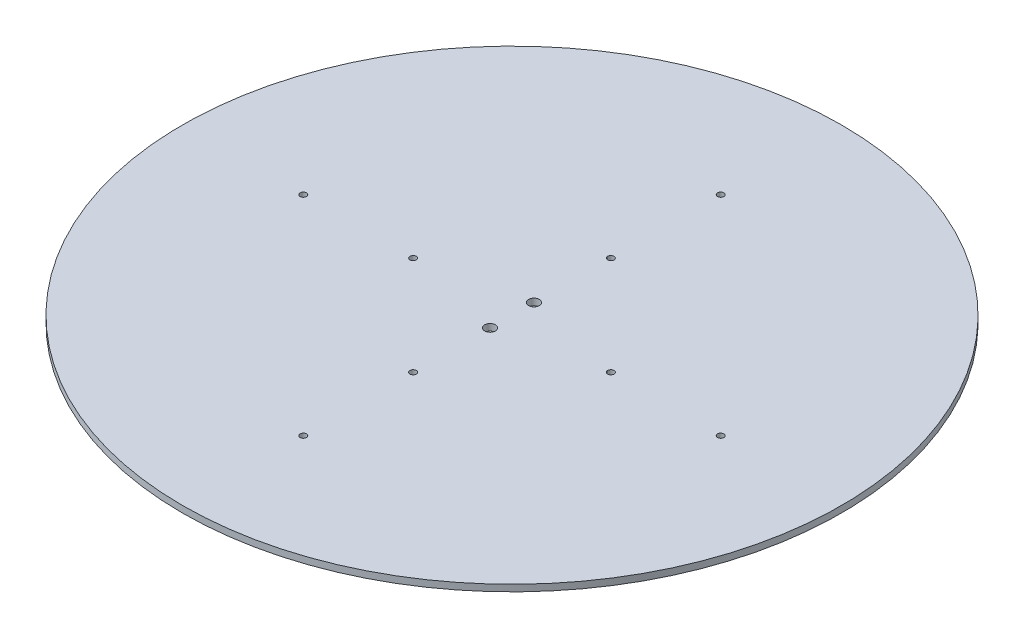
ISO-10303-21;
HEADER;
FILE_DESCRIPTION(('STEP AP214'),'2;1');
FILE_NAME('part.step','',(''),(''),'','','');
FILE_SCHEMA(('AUTOMOTIVE_DESIGN { 1 0 10303 214 1 1 1 1 }'));
ENDSEC;
DATA;
#1=APPLICATION_CONTEXT('core data for automotive mechanical design processes');
#2=APPLICATION_PROTOCOL_DEFINITION('international standard','automotive_design',2000,#1);
#3=PRODUCT_CONTEXT('',#1,'mechanical');
#4=PRODUCT('Part','Part','',(#3));
#5=PRODUCT_RELATED_PRODUCT_CATEGORY('part','',(#4));
#6=PRODUCT_DEFINITION_FORMATION('','',#4);
#7=PRODUCT_DEFINITION_CONTEXT('part definition',#1,'design');
#8=PRODUCT_DEFINITION('design','',#6,#7);
#9=PRODUCT_DEFINITION_SHAPE('','',#8);
#10=(LENGTH_UNIT() NAMED_UNIT(*) SI_UNIT(.MILLI.,.METRE.));
#11=(NAMED_UNIT(*) PLANE_ANGLE_UNIT() SI_UNIT($,.RADIAN.));
#12=(NAMED_UNIT(*) SI_UNIT($,.STERADIAN.) SOLID_ANGLE_UNIT());
#13=UNCERTAINTY_MEASURE_WITH_UNIT(LENGTH_MEASURE(1.E-05),#10,'distance_accuracy_value','');
#14=(GEOMETRIC_REPRESENTATION_CONTEXT(3) GLOBAL_UNCERTAINTY_ASSIGNED_CONTEXT((#13)) GLOBAL_UNIT_ASSIGNED_CONTEXT((#10,
#11,#12)) REPRESENTATION_CONTEXT('',''));
#15=CARTESIAN_POINT('',(0.,0.,0.));
#16=DIRECTION('',(0.,0.,1.));
#17=DIRECTION('',(1.,0.,0.));
#18=AXIS2_PLACEMENT_3D('',#15,#16,#17);
#19=CARTESIAN_POINT('',(-45.,3.,0.));
#20=DIRECTION('',(0.,-1.,0.));
#21=DIRECTION('',(0.,0.,-1.));
#22=AXIS2_PLACEMENT_3D('',#19,#20,#21);
#23=CYLINDRICAL_SURFACE('',#22,1.45);
#24=CARTESIAN_POINT('',(-45.,3.,0.));
#25=DIRECTION('',(0.,1.,0.));
#26=DIRECTION('',(0.,0.,1.));
#27=AXIS2_PLACEMENT_3D('',#24,#25,#26);
#28=CIRCLE('',#27,1.45);
#29=CARTESIAN_POINT('',(-45.,3.,1.45));
#30=VERTEX_POINT('',#29);
#31=EDGE_CURVE('E38',#30,#30,#28,.F.);
#32=ORIENTED_EDGE('',*,*,#31,.F.);
#33=EDGE_LOOP('',(#32));
#34=FACE_BOUND('',#33,.T.);
#35=CARTESIAN_POINT('',(-45.,0.,0.));
#36=DIRECTION('',(0.,1.,0.));
#37=DIRECTION('',(0.,0.,1.));
#38=AXIS2_PLACEMENT_3D('',#35,#36,#37);
#39=CIRCLE('',#38,1.45);
#40=CARTESIAN_POINT('',(-45.,0.,1.45));
#41=VERTEX_POINT('',#40);
#42=EDGE_CURVE('E73',#41,#41,#39,.F.);
#43=ORIENTED_EDGE('',*,*,#42,.T.);
#44=EDGE_LOOP('',(#43));
#45=FACE_BOUND('',#44,.T.);
#46=ADVANCED_FACE('F30',(#34,#45),#23,.F.);
#47=CARTESIAN_POINT('',(0.,3.,0.));
#48=DIRECTION('',(0.,-1.,0.));
#49=DIRECTION('',(0.,0.,-1.));
#50=AXIS2_PLACEMENT_3D('',#47,#48,#49);
#51=CYLINDRICAL_SURFACE('',#50,150.);
#52=CARTESIAN_POINT('',(0.,3.,0.));
#53=DIRECTION('',(0.,1.,0.));
#54=DIRECTION('',(0.,0.,1.));
#55=AXIS2_PLACEMENT_3D('',#52,#53,#54);
#56=CIRCLE('',#55,150.);
#57=CARTESIAN_POINT('',(0.,3.,150.));
#58=VERTEX_POINT('',#57);
#59=EDGE_CURVE('E43',#58,#58,#56,.T.);
#60=ORIENTED_EDGE('',*,*,#59,.F.);
#61=EDGE_LOOP('',(#60));
#62=FACE_BOUND('',#61,.T.);
#63=CARTESIAN_POINT('',(0.,0.,0.));
#64=DIRECTION('',(0.,1.,0.));
#65=DIRECTION('',(0.,0.,1.));
#66=AXIS2_PLACEMENT_3D('',#63,#64,#65);
#67=CIRCLE('',#66,150.);
#68=CARTESIAN_POINT('',(0.,0.,150.));
#69=VERTEX_POINT('',#68);
#70=EDGE_CURVE('E71',#69,#69,#67,.T.);
#71=ORIENTED_EDGE('',*,*,#70,.T.);
#72=EDGE_LOOP('',(#71));
#73=FACE_BOUND('',#72,.T.);
#74=ADVANCED_FACE('F112',(#62,#73),#51,.T.);
#75=CARTESIAN_POINT('',(0.,3.,-10.));
#76=DIRECTION('',(0.,-1.,0.));
#77=DIRECTION('',(0.,0.,-1.));
#78=AXIS2_PLACEMENT_3D('',#75,#76,#77);
#79=CYLINDRICAL_SURFACE('',#78,2.45);
#80=CARTESIAN_POINT('',(0.,3.,-10.));
#81=DIRECTION('',(0.,1.,0.));
#82=DIRECTION('',(0.,0.,1.));
#83=AXIS2_PLACEMENT_3D('',#80,#81,#82);
#84=CIRCLE('',#83,2.45);
#85=CARTESIAN_POINT('',(0.,3.,-7.55));
#86=VERTEX_POINT('',#85);
#87=EDGE_CURVE('E104',#86,#86,#84,.T.);
#88=ORIENTED_EDGE('',*,*,#87,.T.);
#89=EDGE_LOOP('',(#88));
#90=FACE_BOUND('',#89,.T.);
#91=CARTESIAN_POINT('',(0.,0.,-10.));
#92=DIRECTION('',(0.,1.,0.));
#93=DIRECTION('',(0.,0.,1.));
#94=AXIS2_PLACEMENT_3D('',#91,#92,#93);
#95=CIRCLE('',#94,2.45);
#96=CARTESIAN_POINT('',(0.,0.,-7.55));
#97=VERTEX_POINT('',#96);
#98=EDGE_CURVE('E68',#97,#97,#95,.T.);
#99=ORIENTED_EDGE('',*,*,#98,.F.);
#100=EDGE_LOOP('',(#99));
#101=FACE_BOUND('',#100,.T.);
#102=ADVANCED_FACE('F115',(#90,#101),#79,.F.);
#103=CARTESIAN_POINT('',(0.,3.,10.));
#104=DIRECTION('',(0.,-1.,0.));
#105=DIRECTION('',(0.,0.,-1.));
#106=AXIS2_PLACEMENT_3D('',#103,#104,#105);
#107=CYLINDRICAL_SURFACE('',#106,2.45);
#108=CARTESIAN_POINT('',(0.,3.,10.));
#109=DIRECTION('',(0.,1.,0.));
#110=DIRECTION('',(0.,0.,1.));
#111=AXIS2_PLACEMENT_3D('',#108,#109,#110);
#112=CIRCLE('',#111,2.45);
#113=CARTESIAN_POINT('',(0.,3.,12.45));
#114=VERTEX_POINT('',#113);
#115=EDGE_CURVE('E101',#114,#114,#112,.T.);
#116=ORIENTED_EDGE('',*,*,#115,.T.);
#117=EDGE_LOOP('',(#116));
#118=FACE_BOUND('',#117,.T.);
#119=CARTESIAN_POINT('',(0.,0.,10.));
#120=DIRECTION('',(0.,1.,0.));
#121=DIRECTION('',(0.,0.,1.));
#122=AXIS2_PLACEMENT_3D('',#119,#120,#121);
#123=CIRCLE('',#122,2.45);
#124=CARTESIAN_POINT('',(0.,0.,12.45));
#125=VERTEX_POINT('',#124);
#126=EDGE_CURVE('E65',#125,#125,#123,.T.);
#127=ORIENTED_EDGE('',*,*,#126,.F.);
#128=EDGE_LOOP('',(#127));
#129=FACE_BOUND('',#128,.T.);
#130=ADVANCED_FACE('F142',(#118,#129),#107,.F.);
#131=CARTESIAN_POINT('',(45.,3.,0.));
#132=DIRECTION('',(0.,-1.,0.));
#133=DIRECTION('',(0.,0.,-1.));
#134=AXIS2_PLACEMENT_3D('',#131,#132,#133);
#135=CYLINDRICAL_SURFACE('',#134,1.45);
#136=CARTESIAN_POINT('',(45.,3.,0.));
#137=DIRECTION('',(0.,1.,0.));
#138=DIRECTION('',(0.,0.,1.));
#139=AXIS2_PLACEMENT_3D('',#136,#137,#138);
#140=CIRCLE('',#139,1.45);
#141=CARTESIAN_POINT('',(45.,3.,1.45));
#142=VERTEX_POINT('',#141);
#143=EDGE_CURVE('E98',#142,#142,#140,.T.);
#144=ORIENTED_EDGE('',*,*,#143,.T.);
#145=EDGE_LOOP('',(#144));
#146=FACE_BOUND('',#145,.T.);
#147=CARTESIAN_POINT('',(45.,0.,0.));
#148=DIRECTION('',(0.,1.,0.));
#149=DIRECTION('',(0.,0.,1.));
#150=AXIS2_PLACEMENT_3D('',#147,#148,#149);
#151=CIRCLE('',#150,1.45);
#152=CARTESIAN_POINT('',(45.,0.,1.45));
#153=VERTEX_POINT('',#152);
#154=EDGE_CURVE('E62',#153,#153,#151,.T.);
#155=ORIENTED_EDGE('',*,*,#154,.F.);
#156=EDGE_LOOP('',(#155));
#157=FACE_BOUND('',#156,.T.);
#158=ADVANCED_FACE('F146',(#146,#157),#135,.F.);
#159=CARTESIAN_POINT('',(95.,3.,0.));
#160=DIRECTION('',(0.,-1.,0.));
#161=DIRECTION('',(0.,0.,-1.));
#162=AXIS2_PLACEMENT_3D('',#159,#160,#161);
#163=CYLINDRICAL_SURFACE('',#162,1.45);
#164=CARTESIAN_POINT('',(95.,3.,0.));
#165=DIRECTION('',(0.,1.,0.));
#166=DIRECTION('',(0.,0.,1.));
#167=AXIS2_PLACEMENT_3D('',#164,#165,#166);
#168=CIRCLE('',#167,1.45);
#169=CARTESIAN_POINT('',(95.,3.,1.45));
#170=VERTEX_POINT('',#169);
#171=EDGE_CURVE('E95',#170,#170,#168,.T.);
#172=ORIENTED_EDGE('',*,*,#171,.T.);
#173=EDGE_LOOP('',(#172));
#174=FACE_BOUND('',#173,.T.);
#175=CARTESIAN_POINT('',(95.,0.,0.));
#176=DIRECTION('',(0.,1.,0.));
#177=DIRECTION('',(0.,0.,1.));
#178=AXIS2_PLACEMENT_3D('',#175,#176,#177);
#179=CIRCLE('',#178,1.45);
#180=CARTESIAN_POINT('',(95.,0.,1.45));
#181=VERTEX_POINT('',#180);
#182=EDGE_CURVE('E59',#181,#181,#179,.T.);
#183=ORIENTED_EDGE('',*,*,#182,.F.);
#184=EDGE_LOOP('',(#183));
#185=FACE_BOUND('',#184,.T.);
#186=ADVANCED_FACE('F150',(#174,#185),#163,.F.);
#187=CARTESIAN_POINT('',(0.,3.,45.));
#188=DIRECTION('',(0.,-1.,0.));
#189=DIRECTION('',(0.,0.,-1.));
#190=AXIS2_PLACEMENT_3D('',#187,#188,#189);
#191=CYLINDRICAL_SURFACE('',#190,1.45);
#192=CARTESIAN_POINT('',(0.,3.,45.));
#193=DIRECTION('',(0.,1.,0.));
#194=DIRECTION('',(0.,0.,1.));
#195=AXIS2_PLACEMENT_3D('',#192,#193,#194);
#196=CIRCLE('',#195,1.45);
#197=CARTESIAN_POINT('',(0.,3.,46.45));
#198=VERTEX_POINT('',#197);
#199=EDGE_CURVE('E92',#198,#198,#196,.T.);
#200=ORIENTED_EDGE('',*,*,#199,.T.);
#201=EDGE_LOOP('',(#200));
#202=FACE_BOUND('',#201,.T.);
#203=CARTESIAN_POINT('',(0.,0.,45.));
#204=DIRECTION('',(0.,1.,0.));
#205=DIRECTION('',(0.,0.,1.));
#206=AXIS2_PLACEMENT_3D('',#203,#204,#205);
#207=CIRCLE('',#206,1.45);
#208=CARTESIAN_POINT('',(0.,0.,46.45));
#209=VERTEX_POINT('',#208);
#210=EDGE_CURVE('E56',#209,#209,#207,.T.);
#211=ORIENTED_EDGE('',*,*,#210,.F.);
#212=EDGE_LOOP('',(#211));
#213=FACE_BOUND('',#212,.T.);
#214=ADVANCED_FACE('F154',(#202,#213),#191,.F.);
#215=CARTESIAN_POINT('',(0.,3.,95.));
#216=DIRECTION('',(0.,-1.,0.));
#217=DIRECTION('',(0.,0.,-1.));
#218=AXIS2_PLACEMENT_3D('',#215,#216,#217);
#219=CYLINDRICAL_SURFACE('',#218,1.45);
#220=CARTESIAN_POINT('',(0.,3.,95.));
#221=DIRECTION('',(0.,1.,0.));
#222=DIRECTION('',(0.,0.,1.));
#223=AXIS2_PLACEMENT_3D('',#220,#221,#222);
#224=CIRCLE('',#223,1.45);
#225=CARTESIAN_POINT('',(0.,3.,96.45));
#226=VERTEX_POINT('',#225);
#227=EDGE_CURVE('E87',#226,#226,#224,.T.);
#228=ORIENTED_EDGE('',*,*,#227,.T.);
#229=EDGE_LOOP('',(#228));
#230=FACE_BOUND('',#229,.T.);
#231=CARTESIAN_POINT('',(0.,0.,95.));
#232=DIRECTION('',(0.,1.,0.));
#233=DIRECTION('',(0.,0.,1.));
#234=AXIS2_PLACEMENT_3D('',#231,#232,#233);
#235=CIRCLE('',#234,1.45);
#236=CARTESIAN_POINT('',(0.,0.,96.45));
#237=VERTEX_POINT('',#236);
#238=EDGE_CURVE('E53',#237,#237,#235,.T.);
#239=ORIENTED_EDGE('',*,*,#238,.F.);
#240=EDGE_LOOP('',(#239));
#241=FACE_BOUND('',#240,.T.);
#242=ADVANCED_FACE('F158',(#230,#241),#219,.F.);
#243=CARTESIAN_POINT('',(-95.,3.,0.));
#244=DIRECTION('',(0.,-1.,0.));
#245=DIRECTION('',(0.,0.,-1.));
#246=AXIS2_PLACEMENT_3D('',#243,#244,#245);
#247=CYLINDRICAL_SURFACE('',#246,1.45);
#248=CARTESIAN_POINT('',(-95.,3.,0.));
#249=DIRECTION('',(0.,1.,0.));
#250=DIRECTION('',(0.,0.,1.));
#251=AXIS2_PLACEMENT_3D('',#248,#249,#250);
#252=CIRCLE('',#251,1.45);
#253=CARTESIAN_POINT('',(-95.,3.,1.45));
#254=VERTEX_POINT('',#253);
#255=EDGE_CURVE('E82',#254,#254,#252,.F.);
#256=ORIENTED_EDGE('',*,*,#255,.F.);
#257=EDGE_LOOP('',(#256));
#258=FACE_BOUND('',#257,.T.);
#259=CARTESIAN_POINT('',(-95.,0.,0.));
#260=DIRECTION('',(0.,1.,0.));
#261=DIRECTION('',(0.,0.,1.));
#262=AXIS2_PLACEMENT_3D('',#259,#260,#261);
#263=CIRCLE('',#262,1.45);
#264=CARTESIAN_POINT('',(-95.,0.,1.45));
#265=VERTEX_POINT('',#264);
#266=EDGE_CURVE('E50',#265,#265,#263,.F.);
#267=ORIENTED_EDGE('',*,*,#266,.T.);
#268=EDGE_LOOP('',(#267));
#269=FACE_BOUND('',#268,.T.);
#270=ADVANCED_FACE('F161',(#258,#269),#247,.F.);
#271=CARTESIAN_POINT('',(0.,3.,-95.));
#272=DIRECTION('',(0.,-1.,0.));
#273=DIRECTION('',(0.,0.,-1.));
#274=AXIS2_PLACEMENT_3D('',#271,#272,#273);
#275=CYLINDRICAL_SURFACE('',#274,1.45);
#276=CARTESIAN_POINT('',(0.,3.,-95.));
#277=DIRECTION('',(0.,1.,0.));
#278=DIRECTION('',(0.,0.,1.));
#279=AXIS2_PLACEMENT_3D('',#276,#277,#278);
#280=CIRCLE('',#279,1.45);
#281=CARTESIAN_POINT('',(0.,3.,-93.55));
#282=VERTEX_POINT('',#281);
#283=EDGE_CURVE('E78',#282,#282,#280,.F.);
#284=ORIENTED_EDGE('',*,*,#283,.F.);
#285=EDGE_LOOP('',(#284));
#286=FACE_BOUND('',#285,.T.);
#287=CARTESIAN_POINT('',(0.,0.,-95.));
#288=DIRECTION('',(0.,1.,0.));
#289=DIRECTION('',(0.,0.,1.));
#290=AXIS2_PLACEMENT_3D('',#287,#288,#289);
#291=CIRCLE('',#290,1.45);
#292=CARTESIAN_POINT('',(0.,0.,-93.55));
#293=VERTEX_POINT('',#292);
#294=EDGE_CURVE('E47',#293,#293,#291,.F.);
#295=ORIENTED_EDGE('',*,*,#294,.T.);
#296=EDGE_LOOP('',(#295));
#297=FACE_BOUND('',#296,.T.);
#298=ADVANCED_FACE('F32',(#286,#297),#275,.F.);
#299=CARTESIAN_POINT('',(0.,3.,-45.));
#300=DIRECTION('',(0.,-1.,0.));
#301=DIRECTION('',(0.,0.,-1.));
#302=AXIS2_PLACEMENT_3D('',#299,#300,#301);
#303=CYLINDRICAL_SURFACE('',#302,1.45);
#304=CARTESIAN_POINT('',(0.,3.,-45.));
#305=DIRECTION('',(0.,1.,0.));
#306=DIRECTION('',(0.,0.,1.));
#307=AXIS2_PLACEMENT_3D('',#304,#305,#306);
#308=CIRCLE('',#307,1.45);
#309=CARTESIAN_POINT('',(0.,3.,-43.55));
#310=VERTEX_POINT('',#309);
#311=EDGE_CURVE('E10',#310,#310,#308,.F.);
#312=ORIENTED_EDGE('',*,*,#311,.F.);
#313=EDGE_LOOP('',(#312));
#314=FACE_BOUND('',#313,.T.);
#315=CARTESIAN_POINT('',(0.,0.,-45.));
#316=DIRECTION('',(0.,1.,0.));
#317=DIRECTION('',(0.,0.,1.));
#318=AXIS2_PLACEMENT_3D('',#315,#316,#317);
#319=CIRCLE('',#318,1.45);
#320=CARTESIAN_POINT('',(0.,0.,-43.55));
#321=VERTEX_POINT('',#320);
#322=EDGE_CURVE('E34',#321,#321,#319,.F.);
#323=ORIENTED_EDGE('',*,*,#322,.T.);
#324=EDGE_LOOP('',(#323));
#325=FACE_BOUND('',#324,.T.);
#326=ADVANCED_FACE('F128',(#314,#325),#303,.F.);
#327=CARTESIAN_POINT('',(0.,3.,0.));
#328=DIRECTION('',(0.,1.,0.));
#329=DIRECTION('',(0.,0.,1.));
#330=AXIS2_PLACEMENT_3D('',#327,#328,#329);
#331=PLANE('',#330);
#332=ORIENTED_EDGE('',*,*,#283,.T.);
#333=EDGE_LOOP('',(#332));
#334=FACE_BOUND('',#333,.T.);
#335=ORIENTED_EDGE('',*,*,#255,.T.);
#336=EDGE_LOOP('',(#335));
#337=FACE_BOUND('',#336,.T.);
#338=ORIENTED_EDGE('',*,*,#227,.F.);
#339=EDGE_LOOP('',(#338));
#340=FACE_BOUND('',#339,.T.);
#341=ORIENTED_EDGE('',*,*,#199,.F.);
#342=EDGE_LOOP('',(#341));
#343=FACE_BOUND('',#342,.T.);
#344=ORIENTED_EDGE('',*,*,#171,.F.);
#345=EDGE_LOOP('',(#344));
#346=FACE_BOUND('',#345,.T.);
#347=ORIENTED_EDGE('',*,*,#143,.F.);
#348=EDGE_LOOP('',(#347));
#349=FACE_BOUND('',#348,.T.);
#350=ORIENTED_EDGE('',*,*,#115,.F.);
#351=EDGE_LOOP('',(#350));
#352=FACE_BOUND('',#351,.T.);
#353=ORIENTED_EDGE('',*,*,#87,.F.);
#354=EDGE_LOOP('',(#353));
#355=FACE_BOUND('',#354,.T.);
#356=ORIENTED_EDGE('',*,*,#59,.T.);
#357=EDGE_LOOP('',(#356));
#358=FACE_BOUND('',#357,.T.);
#359=ORIENTED_EDGE('',*,*,#31,.T.);
#360=EDGE_LOOP('',(#359));
#361=FACE_BOUND('',#360,.T.);
#362=ORIENTED_EDGE('',*,*,#311,.T.);
#363=EDGE_LOOP('',(#362));
#364=FACE_BOUND('',#363,.T.);
#365=ADVANCED_FACE('F109',(#334,#337,#340,#343,#346,#349,#352,#355,#358,#361,#364),#331,.T.);
#366=CARTESIAN_POINT('',(0.,0.,0.));
#367=DIRECTION('',(0.,1.,0.));
#368=DIRECTION('',(0.,0.,1.));
#369=AXIS2_PLACEMENT_3D('',#366,#367,#368);
#370=PLANE('',#369);
#371=ORIENTED_EDGE('',*,*,#294,.F.);
#372=EDGE_LOOP('',(#371));
#373=FACE_BOUND('',#372,.T.);
#374=ORIENTED_EDGE('',*,*,#266,.F.);
#375=EDGE_LOOP('',(#374));
#376=FACE_BOUND('',#375,.T.);
#377=ORIENTED_EDGE('',*,*,#238,.T.);
#378=EDGE_LOOP('',(#377));
#379=FACE_BOUND('',#378,.T.);
#380=ORIENTED_EDGE('',*,*,#210,.T.);
#381=EDGE_LOOP('',(#380));
#382=FACE_BOUND('',#381,.T.);
#383=ORIENTED_EDGE('',*,*,#182,.T.);
#384=EDGE_LOOP('',(#383));
#385=FACE_BOUND('',#384,.T.);
#386=ORIENTED_EDGE('',*,*,#154,.T.);
#387=EDGE_LOOP('',(#386));
#388=FACE_BOUND('',#387,.T.);
#389=ORIENTED_EDGE('',*,*,#126,.T.);
#390=EDGE_LOOP('',(#389));
#391=FACE_BOUND('',#390,.T.);
#392=ORIENTED_EDGE('',*,*,#98,.T.);
#393=EDGE_LOOP('',(#392));
#394=FACE_BOUND('',#393,.T.);
#395=ORIENTED_EDGE('',*,*,#70,.F.);
#396=EDGE_LOOP('',(#395));
#397=FACE_BOUND('',#396,.T.);
#398=ORIENTED_EDGE('',*,*,#42,.F.);
#399=EDGE_LOOP('',(#398));
#400=FACE_BOUND('',#399,.T.);
#401=ORIENTED_EDGE('',*,*,#322,.F.);
#402=EDGE_LOOP('',(#401));
#403=FACE_BOUND('',#402,.T.);
#404=ADVANCED_FACE('F119',(#373,#376,#379,#382,#385,#388,#391,#394,#397,#400,#403),#370,.F.);
#405=CLOSED_SHELL('',(#46,#74,#102,#130,#158,#186,#214,#242,#270,#298,#326,#365,#404));
#406=MANIFOLD_SOLID_BREP('B2',#405);
#407=ADVANCED_BREP_SHAPE_REPRESENTATION('',(#18,#406),#14);
#408=SHAPE_DEFINITION_REPRESENTATION(#9,#407);
ENDSEC;
END-ISO-10303-21;
